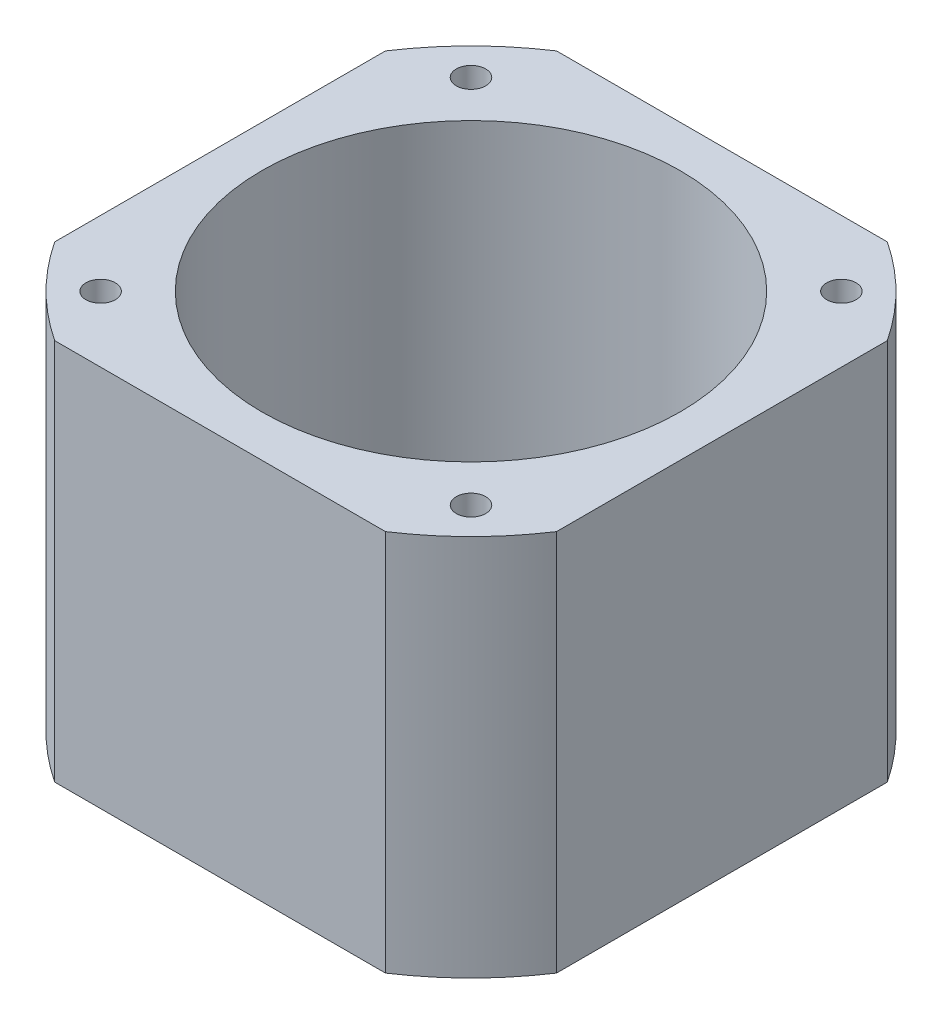
ISO-10303-21;
HEADER;
FILE_DESCRIPTION(('STEP AP214'),'2;1');
FILE_NAME('part.step','',(''),(''),'','','');
FILE_SCHEMA(('AUTOMOTIVE_DESIGN { 1 0 10303 214 1 1 1 1 }'));
ENDSEC;
DATA;
#1=APPLICATION_CONTEXT('core data for automotive mechanical design processes');
#2=APPLICATION_PROTOCOL_DEFINITION('international standard','automotive_design',2000,#1);
#3=PRODUCT_CONTEXT('',#1,'mechanical');
#4=PRODUCT('Part','Part','',(#3));
#5=PRODUCT_RELATED_PRODUCT_CATEGORY('part','',(#4));
#6=PRODUCT_DEFINITION_FORMATION('','',#4);
#7=PRODUCT_DEFINITION_CONTEXT('part definition',#1,'design');
#8=PRODUCT_DEFINITION('design','',#6,#7);
#9=PRODUCT_DEFINITION_SHAPE('','',#8);
#10=(LENGTH_UNIT() NAMED_UNIT(*) SI_UNIT(.MILLI.,.METRE.));
#11=(NAMED_UNIT(*) PLANE_ANGLE_UNIT() SI_UNIT($,.RADIAN.));
#12=(NAMED_UNIT(*) SI_UNIT($,.STERADIAN.) SOLID_ANGLE_UNIT());
#13=UNCERTAINTY_MEASURE_WITH_UNIT(LENGTH_MEASURE(1.E-05),#10,'distance_accuracy_value','');
#14=(GEOMETRIC_REPRESENTATION_CONTEXT(3) GLOBAL_UNCERTAINTY_ASSIGNED_CONTEXT((#13)) GLOBAL_UNIT_ASSIGNED_CONTEXT((#10,
#11,#12)) REPRESENTATION_CONTEXT('',''));
#15=CARTESIAN_POINT('',(0.,0.,0.));
#16=DIRECTION('',(0.,0.,1.));
#17=DIRECTION('',(1.,0.,0.));
#18=AXIS2_PLACEMENT_3D('',#15,#16,#17);
#19=CARTESIAN_POINT('',(15.5,0.,15.5));
#20=DIRECTION('',(0.,-1.,0.));
#21=DIRECTION('',(1.,0.,0.));
#22=AXIS2_PLACEMENT_3D('',#19,#20,#21);
#23=CYLINDRICAL_SURFACE('',#22,1.23);
#24=DIRECTION('',(0.,1.,0.));
#25=VECTOR('',#24,1.);
#26=CARTESIAN_POINT('',(16.73,0.,15.5));
#27=LINE('',#26,#25);
#28=CARTESIAN_POINT('',(16.73,0.,15.5));
#29=VERTEX_POINT('',#28);
#30=CARTESIAN_POINT('',(16.73,32.,15.5));
#31=VERTEX_POINT('',#30);
#32=EDGE_CURVE('E11',#29,#31,#27,.T.);
#33=ORIENTED_EDGE('',*,*,#32,.T.);
#34=CARTESIAN_POINT('',(15.5,32.,15.5));
#35=DIRECTION('',(0.,-1.,0.));
#36=DIRECTION('',(1.,0.,0.));
#37=AXIS2_PLACEMENT_3D('',#34,#35,#36);
#38=CIRCLE('',#37,1.23);
#39=EDGE_CURVE('E242',#31,#31,#38,.T.);
#40=ORIENTED_EDGE('',*,*,#39,.F.);
#41=ORIENTED_EDGE('',*,*,#32,.F.);
#42=CARTESIAN_POINT('',(15.5,0.,15.5));
#43=DIRECTION('',(0.,-1.,0.));
#44=DIRECTION('',(1.,0.,0.));
#45=AXIS2_PLACEMENT_3D('',#42,#43,#44);
#46=CIRCLE('',#45,1.23);
#47=EDGE_CURVE('E212',#29,#29,#46,.T.);
#48=ORIENTED_EDGE('',*,*,#47,.T.);
#49=EDGE_LOOP('',(#33,#40,#41,#48));
#50=FACE_BOUND('',#49,.T.);
#51=ADVANCED_FACE('F16',(#50),#23,.F.);
#52=CARTESIAN_POINT('',(0.,0.,0.));
#53=DIRECTION('',(0.,-1.,0.));
#54=DIRECTION('',(1.,0.,0.));
#55=AXIS2_PLACEMENT_3D('',#52,#53,#54);
#56=CYLINDRICAL_SURFACE('',#55,17.5);
#57=DIRECTION('',(0.,1.,0.));
#58=VECTOR('',#57,1.);
#59=CARTESIAN_POINT('',(17.5,0.,0.));
#60=LINE('',#59,#58);
#61=CARTESIAN_POINT('',(17.5,0.,0.));
#62=VERTEX_POINT('',#61);
#63=CARTESIAN_POINT('',(17.5,32.,0.));
#64=VERTEX_POINT('',#63);
#65=EDGE_CURVE('E27',#62,#64,#60,.T.);
#66=ORIENTED_EDGE('',*,*,#65,.T.);
#67=CARTESIAN_POINT('',(0.,32.,0.));
#68=DIRECTION('',(0.,1.,0.));
#69=DIRECTION('',(1.,0.,0.));
#70=AXIS2_PLACEMENT_3D('',#67,#68,#69);
#71=CIRCLE('',#70,17.5);
#72=EDGE_CURVE('E239',#64,#64,#71,.T.);
#73=ORIENTED_EDGE('',*,*,#72,.T.);
#74=ORIENTED_EDGE('',*,*,#65,.F.);
#75=CARTESIAN_POINT('',(0.,0.,0.));
#76=DIRECTION('',(0.,1.,0.));
#77=DIRECTION('',(1.,0.,0.));
#78=AXIS2_PLACEMENT_3D('',#75,#76,#77);
#79=CIRCLE('',#78,17.5);
#80=EDGE_CURVE('E208',#62,#62,#79,.T.);
#81=ORIENTED_EDGE('',*,*,#80,.F.);
#82=EDGE_LOOP('',(#66,#73,#74,#81));
#83=FACE_BOUND('',#82,.T.);
#84=ADVANCED_FACE('F330',(#83),#56,.F.);
#85=CARTESIAN_POINT('',(15.5,0.,-15.5));
#86=DIRECTION('',(0.,-1.,0.));
#87=DIRECTION('',(1.,0.,0.));
#88=AXIS2_PLACEMENT_3D('',#85,#86,#87);
#89=CYLINDRICAL_SURFACE('',#88,1.23);
#90=DIRECTION('',(0.,1.,0.));
#91=VECTOR('',#90,1.);
#92=CARTESIAN_POINT('',(16.73,0.,-15.5));
#93=LINE('',#92,#91);
#94=CARTESIAN_POINT('',(16.73,0.,-15.5));
#95=VERTEX_POINT('',#94);
#96=CARTESIAN_POINT('',(16.73,32.,-15.5));
#97=VERTEX_POINT('',#96);
#98=EDGE_CURVE('E127',#95,#97,#93,.T.);
#99=ORIENTED_EDGE('',*,*,#98,.T.);
#100=CARTESIAN_POINT('',(15.5,32.,-15.5));
#101=DIRECTION('',(0.,-1.,0.));
#102=DIRECTION('',(1.,0.,0.));
#103=AXIS2_PLACEMENT_3D('',#100,#101,#102);
#104=CIRCLE('',#103,1.23);
#105=EDGE_CURVE('E192',#97,#97,#104,.T.);
#106=ORIENTED_EDGE('',*,*,#105,.F.);
#107=ORIENTED_EDGE('',*,*,#98,.F.);
#108=CARTESIAN_POINT('',(15.5,0.,-15.5));
#109=DIRECTION('',(0.,-1.,0.));
#110=DIRECTION('',(1.,0.,0.));
#111=AXIS2_PLACEMENT_3D('',#108,#109,#110);
#112=CIRCLE('',#111,1.23);
#113=EDGE_CURVE('E213',#95,#95,#112,.T.);
#114=ORIENTED_EDGE('',*,*,#113,.T.);
#115=EDGE_LOOP('',(#99,#106,#107,#114));
#116=FACE_BOUND('',#115,.T.);
#117=ADVANCED_FACE('F274',(#116),#89,.F.);
#118=CARTESIAN_POINT('',(-15.5,0.,15.5));
#119=DIRECTION('',(0.,-1.,0.));
#120=DIRECTION('',(1.,0.,0.));
#121=AXIS2_PLACEMENT_3D('',#118,#119,#120);
#122=CYLINDRICAL_SURFACE('',#121,1.23);
#123=DIRECTION('',(0.,1.,0.));
#124=VECTOR('',#123,1.);
#125=CARTESIAN_POINT('',(-14.27,0.,15.5));
#126=LINE('',#125,#124);
#127=CARTESIAN_POINT('',(-14.27,0.,15.5));
#128=VERTEX_POINT('',#127);
#129=CARTESIAN_POINT('',(-14.27,32.,15.5));
#130=VERTEX_POINT('',#129);
#131=EDGE_CURVE('E115',#128,#130,#126,.T.);
#132=ORIENTED_EDGE('',*,*,#131,.T.);
#133=CARTESIAN_POINT('',(-15.5,32.,15.5));
#134=DIRECTION('',(0.,-1.,0.));
#135=DIRECTION('',(1.,0.,0.));
#136=AXIS2_PLACEMENT_3D('',#133,#134,#135);
#137=CIRCLE('',#136,1.23);
#138=EDGE_CURVE('E190',#130,#130,#137,.T.);
#139=ORIENTED_EDGE('',*,*,#138,.F.);
#140=ORIENTED_EDGE('',*,*,#131,.F.);
#141=CARTESIAN_POINT('',(-15.5,0.,15.5));
#142=DIRECTION('',(0.,-1.,0.));
#143=DIRECTION('',(1.,0.,0.));
#144=AXIS2_PLACEMENT_3D('',#141,#142,#143);
#145=CIRCLE('',#144,1.23);
#146=EDGE_CURVE('E223',#128,#128,#145,.T.);
#147=ORIENTED_EDGE('',*,*,#146,.T.);
#148=EDGE_LOOP('',(#132,#139,#140,#147));
#149=FACE_BOUND('',#148,.T.);
#150=ADVANCED_FACE('F346',(#149),#122,.F.);
#151=CARTESIAN_POINT('',(-15.5,0.,-15.5));
#152=DIRECTION('',(0.,-1.,0.));
#153=DIRECTION('',(1.,0.,0.));
#154=AXIS2_PLACEMENT_3D('',#151,#152,#153);
#155=CYLINDRICAL_SURFACE('',#154,1.23);
#156=DIRECTION('',(0.,1.,0.));
#157=VECTOR('',#156,1.);
#158=CARTESIAN_POINT('',(-14.27,0.,-15.5));
#159=LINE('',#158,#157);
#160=CARTESIAN_POINT('',(-14.27,0.,-15.5));
#161=VERTEX_POINT('',#160);
#162=CARTESIAN_POINT('',(-14.27,32.,-15.5));
#163=VERTEX_POINT('',#162);
#164=EDGE_CURVE('E249',#161,#163,#159,.T.);
#165=ORIENTED_EDGE('',*,*,#164,.T.);
#166=CARTESIAN_POINT('',(-15.5,32.,-15.5));
#167=DIRECTION('',(0.,-1.,0.));
#168=DIRECTION('',(1.,0.,0.));
#169=AXIS2_PLACEMENT_3D('',#166,#167,#168);
#170=CIRCLE('',#169,1.23);
#171=EDGE_CURVE('E193',#163,#163,#170,.T.);
#172=ORIENTED_EDGE('',*,*,#171,.F.);
#173=ORIENTED_EDGE('',*,*,#164,.F.);
#174=CARTESIAN_POINT('',(-15.5,0.,-15.5));
#175=DIRECTION('',(0.,-1.,0.));
#176=DIRECTION('',(1.,0.,0.));
#177=AXIS2_PLACEMENT_3D('',#174,#175,#176);
#178=CIRCLE('',#177,1.23);
#179=EDGE_CURVE('E166',#161,#161,#178,.T.);
#180=ORIENTED_EDGE('',*,*,#179,.T.);
#181=EDGE_LOOP('',(#165,#172,#173,#180));
#182=FACE_BOUND('',#181,.T.);
#183=ADVANCED_FACE('F343',(#182),#155,.F.);
#184=CARTESIAN_POINT('',(-13.83916543726,0.,21.));
#185=DIRECTION('',(0.,0.,-1.));
#186=DIRECTION('',(-1.,0.,0.));
#187=AXIS2_PLACEMENT_3D('',#184,#185,#186);
#188=PLANE('',#187);
#189=DIRECTION('',(1.,0.,0.));
#190=VECTOR('',#189,1.);
#191=CARTESIAN_POINT('',(-13.83916543726,0.,21.));
#192=LINE('',#191,#190);
#193=CARTESIAN_POINT('',(-13.83916543726,0.,21.));
#194=VERTEX_POINT('',#193);
#195=CARTESIAN_POINT('',(13.839165437265,0.,21.));
#196=VERTEX_POINT('',#195);
#197=EDGE_CURVE('E194',#194,#196,#192,.T.);
#198=ORIENTED_EDGE('',*,*,#197,.T.);
#199=DIRECTION('',(0.,1.,0.));
#200=VECTOR('',#199,1.);
#201=CARTESIAN_POINT('',(13.839165437265,0.,21.));
#202=LINE('',#201,#200);
#203=CARTESIAN_POINT('',(13.839165437265,32.,21.));
#204=VERTEX_POINT('',#203);
#205=EDGE_CURVE('E259',#196,#204,#202,.T.);
#206=ORIENTED_EDGE('',*,*,#205,.T.);
#207=DIRECTION('',(1.,0.,0.));
#208=VECTOR('',#207,1.);
#209=CARTESIAN_POINT('',(-13.83916543726,32.,21.));
#210=LINE('',#209,#208);
#211=CARTESIAN_POINT('',(-13.83916543726,32.,21.));
#212=VERTEX_POINT('',#211);
#213=EDGE_CURVE('E203',#212,#204,#210,.T.);
#214=ORIENTED_EDGE('',*,*,#213,.F.);
#215=DIRECTION('',(0.,1.,0.));
#216=VECTOR('',#215,1.);
#217=CARTESIAN_POINT('',(-13.83916543726,0.,21.));
#218=LINE('',#217,#216);
#219=EDGE_CURVE('E252',#194,#212,#218,.T.);
#220=ORIENTED_EDGE('',*,*,#219,.F.);
#221=EDGE_LOOP('',(#198,#206,#214,#220));
#222=FACE_BOUND('',#221,.T.);
#223=ADVANCED_FACE('F299',(#222),#188,.F.);
#224=CARTESIAN_POINT('',(0.,0.,0.));
#225=DIRECTION('',(0.,-1.,0.));
#226=DIRECTION('',(1.,0.,0.));
#227=AXIS2_PLACEMENT_3D('',#224,#225,#226);
#228=CYLINDRICAL_SURFACE('',#227,25.15);
#229=CARTESIAN_POINT('',(0.,0.,0.));
#230=DIRECTION('',(0.,1.,0.));
#231=DIRECTION('',(1.,0.,0.));
#232=AXIS2_PLACEMENT_3D('',#229,#230,#231);
#233=CIRCLE('',#232,25.15);
#234=CARTESIAN_POINT('',(-21.,0.,13.839165437265));
#235=VERTEX_POINT('',#234);
#236=EDGE_CURVE('E20',#235,#194,#233,.T.);
#237=ORIENTED_EDGE('',*,*,#236,.T.);
#238=ORIENTED_EDGE('',*,*,#219,.T.);
#239=CARTESIAN_POINT('',(0.,32.,0.));
#240=DIRECTION('',(0.,1.,0.));
#241=DIRECTION('',(1.,0.,0.));
#242=AXIS2_PLACEMENT_3D('',#239,#240,#241);
#243=CIRCLE('',#242,25.15);
#244=CARTESIAN_POINT('',(-21.,32.,13.839165437265));
#245=VERTEX_POINT('',#244);
#246=EDGE_CURVE('E199',#245,#212,#243,.T.);
#247=ORIENTED_EDGE('',*,*,#246,.F.);
#248=DIRECTION('',(0.,1.,0.));
#249=VECTOR('',#248,1.);
#250=CARTESIAN_POINT('',(-21.,0.,13.839165437265));
#251=LINE('',#250,#249);
#252=EDGE_CURVE('E256',#235,#245,#251,.T.);
#253=ORIENTED_EDGE('',*,*,#252,.F.);
#254=EDGE_LOOP('',(#237,#238,#247,#253));
#255=FACE_BOUND('',#254,.T.);
#256=ADVANCED_FACE('F297',(#255),#228,.T.);
#257=CARTESIAN_POINT('',(0.,0.,0.));
#258=DIRECTION('',(0.,-1.,0.));
#259=DIRECTION('',(1.,0.,0.));
#260=AXIS2_PLACEMENT_3D('',#257,#258,#259);
#261=CYLINDRICAL_SURFACE('',#260,25.15);
#262=CARTESIAN_POINT('',(0.,0.,0.));
#263=DIRECTION('',(0.,1.,0.));
#264=DIRECTION('',(1.,0.,0.));
#265=AXIS2_PLACEMENT_3D('',#262,#263,#264);
#266=CIRCLE('',#265,25.15);
#267=CARTESIAN_POINT('',(21.,0.,13.839165437265));
#268=VERTEX_POINT('',#267);
#269=EDGE_CURVE('E198',#196,#268,#266,.T.);
#270=ORIENTED_EDGE('',*,*,#269,.T.);
#271=DIRECTION('',(0.,1.,0.));
#272=VECTOR('',#271,1.);
#273=CARTESIAN_POINT('',(21.,0.,13.839165437265));
#274=LINE('',#273,#272);
#275=CARTESIAN_POINT('',(21.,32.,13.839165437265));
#276=VERTEX_POINT('',#275);
#277=EDGE_CURVE('E260',#268,#276,#274,.T.);
#278=ORIENTED_EDGE('',*,*,#277,.T.);
#279=CARTESIAN_POINT('',(0.,32.,0.));
#280=DIRECTION('',(0.,1.,0.));
#281=DIRECTION('',(1.,0.,0.));
#282=AXIS2_PLACEMENT_3D('',#279,#280,#281);
#283=CIRCLE('',#282,25.15);
#284=EDGE_CURVE('E207',#204,#276,#283,.T.);
#285=ORIENTED_EDGE('',*,*,#284,.F.);
#286=ORIENTED_EDGE('',*,*,#205,.F.);
#287=EDGE_LOOP('',(#270,#278,#285,#286));
#288=FACE_BOUND('',#287,.T.);
#289=ADVANCED_FACE('F317',(#288),#261,.T.);
#290=CARTESIAN_POINT('',(-21.,0.,-13.83916543726));
#291=DIRECTION('',(1.,0.,0.));
#292=DIRECTION('',(0.,1.,0.));
#293=AXIS2_PLACEMENT_3D('',#290,#291,#292);
#294=PLANE('',#293);
#295=DIRECTION('',(0.,0.,1.));
#296=VECTOR('',#295,1.);
#297=CARTESIAN_POINT('',(-21.,0.,-13.83916543726));
#298=LINE('',#297,#296);
#299=CARTESIAN_POINT('',(-21.,0.,-13.83916543726));
#300=VERTEX_POINT('',#299);
#301=EDGE_CURVE('E158',#300,#235,#298,.T.);
#302=ORIENTED_EDGE('',*,*,#301,.T.);
#303=ORIENTED_EDGE('',*,*,#252,.T.);
#304=DIRECTION('',(0.,0.,1.));
#305=VECTOR('',#304,1.);
#306=CARTESIAN_POINT('',(-21.,32.,-13.83916543726));
#307=LINE('',#306,#305);
#308=CARTESIAN_POINT('',(-21.,32.,-13.83916543726));
#309=VERTEX_POINT('',#308);
#310=EDGE_CURVE('E171',#309,#245,#307,.T.);
#311=ORIENTED_EDGE('',*,*,#310,.F.);
#312=DIRECTION('',(0.,1.,0.));
#313=VECTOR('',#312,1.);
#314=CARTESIAN_POINT('',(-21.,0.,-13.83916543726));
#315=LINE('',#314,#313);
#316=EDGE_CURVE('E168',#300,#309,#315,.T.);
#317=ORIENTED_EDGE('',*,*,#316,.F.);
#318=EDGE_LOOP('',(#302,#303,#311,#317));
#319=FACE_BOUND('',#318,.T.);
#320=ADVANCED_FACE('F169',(#319),#294,.F.);
#321=CARTESIAN_POINT('',(21.,0.,13.839165437265));
#322=DIRECTION('',(-1.,0.,0.));
#323=DIRECTION('',(0.,0.,1.));
#324=AXIS2_PLACEMENT_3D('',#321,#322,#323);
#325=PLANE('',#324);
#326=DIRECTION('',(0.,0.,-1.));
#327=VECTOR('',#326,1.);
#328=CARTESIAN_POINT('',(21.,0.,13.839165437265));
#329=LINE('',#328,#327);
#330=CARTESIAN_POINT('',(21.,0.,-13.83916543726));
#331=VERTEX_POINT('',#330);
#332=EDGE_CURVE('E222',#268,#331,#329,.T.);
#333=ORIENTED_EDGE('',*,*,#332,.T.);
#334=DIRECTION('',(0.,1.,0.));
#335=VECTOR('',#334,1.);
#336=CARTESIAN_POINT('',(21.,0.,-13.83916543726));
#337=LINE('',#336,#335);
#338=CARTESIAN_POINT('',(21.,32.,-13.83916543726));
#339=VERTEX_POINT('',#338);
#340=EDGE_CURVE('E178',#331,#339,#337,.T.);
#341=ORIENTED_EDGE('',*,*,#340,.T.);
#342=DIRECTION('',(0.,0.,-1.));
#343=VECTOR('',#342,1.);
#344=CARTESIAN_POINT('',(21.,32.,13.839165437265));
#345=LINE('',#344,#343);
#346=EDGE_CURVE('E204',#276,#339,#345,.T.);
#347=ORIENTED_EDGE('',*,*,#346,.F.);
#348=ORIENTED_EDGE('',*,*,#277,.F.);
#349=EDGE_LOOP('',(#333,#341,#347,#348));
#350=FACE_BOUND('',#349,.T.);
#351=ADVANCED_FACE('F314',(#350),#325,.F.);
#352=CARTESIAN_POINT('',(0.,32.,0.));
#353=DIRECTION('',(0.,1.,0.));
#354=DIRECTION('',(0.,0.,-1.));
#355=AXIS2_PLACEMENT_3D('',#352,#353,#354);
#356=PLANE('',#355);
#357=ORIENTED_EDGE('',*,*,#39,.T.);
#358=EDGE_LOOP('',(#357));
#359=FACE_BOUND('',#358,.T.);
#360=ORIENTED_EDGE('',*,*,#72,.F.);
#361=EDGE_LOOP('',(#360));
#362=FACE_BOUND('',#361,.T.);
#363=ORIENTED_EDGE('',*,*,#105,.T.);
#364=EDGE_LOOP('',(#363));
#365=FACE_BOUND('',#364,.T.);
#366=ORIENTED_EDGE('',*,*,#138,.T.);
#367=EDGE_LOOP('',(#366));
#368=FACE_BOUND('',#367,.T.);
#369=ORIENTED_EDGE('',*,*,#171,.T.);
#370=EDGE_LOOP('',(#369));
#371=FACE_BOUND('',#370,.T.);
#372=DIRECTION('',(-1.,0.,0.));
#373=VECTOR('',#372,1.);
#374=CARTESIAN_POINT('',(13.839165437265,32.,-21.));
#375=LINE('',#374,#373);
#376=CARTESIAN_POINT('',(13.839165437265,32.,-21.));
#377=VERTEX_POINT('',#376);
#378=CARTESIAN_POINT('',(-13.83916543726,32.,-21.));
#379=VERTEX_POINT('',#378);
#380=EDGE_CURVE('E219',#377,#379,#375,.T.);
#381=ORIENTED_EDGE('',*,*,#380,.T.);
#382=CARTESIAN_POINT('',(0.,32.,0.));
#383=DIRECTION('',(0.,1.,0.));
#384=DIRECTION('',(1.,0.,0.));
#385=AXIS2_PLACEMENT_3D('',#382,#383,#384);
#386=CIRCLE('',#385,25.15);
#387=EDGE_CURVE('E69',#379,#309,#386,.T.);
#388=ORIENTED_EDGE('',*,*,#387,.T.);
#389=ORIENTED_EDGE('',*,*,#310,.T.);
#390=ORIENTED_EDGE('',*,*,#246,.T.);
#391=ORIENTED_EDGE('',*,*,#213,.T.);
#392=ORIENTED_EDGE('',*,*,#284,.T.);
#393=ORIENTED_EDGE('',*,*,#346,.T.);
#394=CARTESIAN_POINT('',(0.,32.,0.));
#395=DIRECTION('',(0.,1.,0.));
#396=DIRECTION('',(1.,0.,0.));
#397=AXIS2_PLACEMENT_3D('',#394,#395,#396);
#398=CIRCLE('',#397,25.15);
#399=EDGE_CURVE('E185',#339,#377,#398,.T.);
#400=ORIENTED_EDGE('',*,*,#399,.T.);
#401=EDGE_LOOP('',(#381,#388,#389,#390,#391,#392,#393,#400));
#402=FACE_BOUND('',#401,.T.);
#403=ADVANCED_FACE('F18',(#359,#362,#365,#368,#371,#402),#356,.T.);
#404=CARTESIAN_POINT('',(0.,0.,0.));
#405=DIRECTION('',(0.,1.,0.));
#406=DIRECTION('',(0.,0.,-1.));
#407=AXIS2_PLACEMENT_3D('',#404,#405,#406);
#408=PLANE('',#407);
#409=ORIENTED_EDGE('',*,*,#47,.F.);
#410=EDGE_LOOP('',(#409));
#411=FACE_BOUND('',#410,.T.);
#412=ORIENTED_EDGE('',*,*,#80,.T.);
#413=EDGE_LOOP('',(#412));
#414=FACE_BOUND('',#413,.T.);
#415=ORIENTED_EDGE('',*,*,#113,.F.);
#416=EDGE_LOOP('',(#415));
#417=FACE_BOUND('',#416,.T.);
#418=ORIENTED_EDGE('',*,*,#146,.F.);
#419=EDGE_LOOP('',(#418));
#420=FACE_BOUND('',#419,.T.);
#421=ORIENTED_EDGE('',*,*,#179,.F.);
#422=EDGE_LOOP('',(#421));
#423=FACE_BOUND('',#422,.T.);
#424=CARTESIAN_POINT('',(0.,0.,0.));
#425=DIRECTION('',(0.,1.,0.));
#426=DIRECTION('',(1.,0.,0.));
#427=AXIS2_PLACEMENT_3D('',#424,#425,#426);
#428=CIRCLE('',#427,25.15);
#429=CARTESIAN_POINT('',(13.839165437265,0.,-21.));
#430=VERTEX_POINT('',#429);
#431=EDGE_CURVE('E218',#331,#430,#428,.T.);
#432=ORIENTED_EDGE('',*,*,#431,.F.);
#433=ORIENTED_EDGE('',*,*,#332,.F.);
#434=ORIENTED_EDGE('',*,*,#269,.F.);
#435=ORIENTED_EDGE('',*,*,#197,.F.);
#436=ORIENTED_EDGE('',*,*,#236,.F.);
#437=ORIENTED_EDGE('',*,*,#301,.F.);
#438=CARTESIAN_POINT('',(0.,0.,0.));
#439=DIRECTION('',(0.,1.,0.));
#440=DIRECTION('',(1.,0.,0.));
#441=AXIS2_PLACEMENT_3D('',#438,#439,#440);
#442=CIRCLE('',#441,25.15);
#443=CARTESIAN_POINT('',(-13.83916543726,0.,-21.));
#444=VERTEX_POINT('',#443);
#445=EDGE_CURVE('E85',#444,#300,#442,.T.);
#446=ORIENTED_EDGE('',*,*,#445,.F.);
#447=DIRECTION('',(-1.,0.,0.));
#448=VECTOR('',#447,1.);
#449=CARTESIAN_POINT('',(13.839165437265,0.,-21.));
#450=LINE('',#449,#448);
#451=EDGE_CURVE('E234',#430,#444,#450,.T.);
#452=ORIENTED_EDGE('',*,*,#451,.F.);
#453=EDGE_LOOP('',(#432,#433,#434,#435,#436,#437,#446,#452));
#454=FACE_BOUND('',#453,.T.);
#455=ADVANCED_FACE('F161',(#411,#414,#417,#420,#423,#454),#408,.F.);
#456=CARTESIAN_POINT('',(0.,0.,0.));
#457=DIRECTION('',(0.,-1.,0.));
#458=DIRECTION('',(1.,0.,0.));
#459=AXIS2_PLACEMENT_3D('',#456,#457,#458);
#460=CYLINDRICAL_SURFACE('',#459,25.15);
#461=ORIENTED_EDGE('',*,*,#445,.T.);
#462=ORIENTED_EDGE('',*,*,#316,.T.);
#463=ORIENTED_EDGE('',*,*,#387,.F.);
#464=DIRECTION('',(0.,1.,0.));
#465=VECTOR('',#464,1.);
#466=CARTESIAN_POINT('',(-13.83916543726,0.,-21.));
#467=LINE('',#466,#465);
#468=EDGE_CURVE('E175',#444,#379,#467,.T.);
#469=ORIENTED_EDGE('',*,*,#468,.F.);
#470=EDGE_LOOP('',(#461,#462,#463,#469));
#471=FACE_BOUND('',#470,.T.);
#472=ADVANCED_FACE('F173',(#471),#460,.T.);
#473=CARTESIAN_POINT('',(0.,0.,0.));
#474=DIRECTION('',(0.,-1.,0.));
#475=DIRECTION('',(1.,0.,0.));
#476=AXIS2_PLACEMENT_3D('',#473,#474,#475);
#477=CYLINDRICAL_SURFACE('',#476,25.15);
#478=ORIENTED_EDGE('',*,*,#431,.T.);
#479=DIRECTION('',(0.,1.,0.));
#480=VECTOR('',#479,1.);
#481=CARTESIAN_POINT('',(13.839165437265,0.,-21.));
#482=LINE('',#481,#480);
#483=EDGE_CURVE('E214',#430,#377,#482,.T.);
#484=ORIENTED_EDGE('',*,*,#483,.T.);
#485=ORIENTED_EDGE('',*,*,#399,.F.);
#486=ORIENTED_EDGE('',*,*,#340,.F.);
#487=EDGE_LOOP('',(#478,#484,#485,#486));
#488=FACE_BOUND('',#487,.T.);
#489=ADVANCED_FACE('F311',(#488),#477,.T.);
#490=CARTESIAN_POINT('',(13.839165437265,0.,-21.));
#491=DIRECTION('',(0.,0.,1.));
#492=DIRECTION('',(0.,-1.,0.));
#493=AXIS2_PLACEMENT_3D('',#490,#491,#492);
#494=PLANE('',#493);
#495=ORIENTED_EDGE('',*,*,#451,.T.);
#496=ORIENTED_EDGE('',*,*,#468,.T.);
#497=ORIENTED_EDGE('',*,*,#380,.F.);
#498=ORIENTED_EDGE('',*,*,#483,.F.);
#499=EDGE_LOOP('',(#495,#496,#497,#498));
#500=FACE_BOUND('',#499,.T.);
#501=ADVANCED_FACE('F306',(#500),#494,.F.);
#502=CLOSED_SHELL('',(#51,#84,#117,#150,#183,#223,#256,#289,#320,#351,#403,#455,#472,#489,#501));
#503=MANIFOLD_SOLID_BREP('B1',#502);
#504=ADVANCED_BREP_SHAPE_REPRESENTATION('',(#18,#503),#14);
#505=SHAPE_DEFINITION_REPRESENTATION(#9,#504);
ENDSEC;
END-ISO-10303-21;
